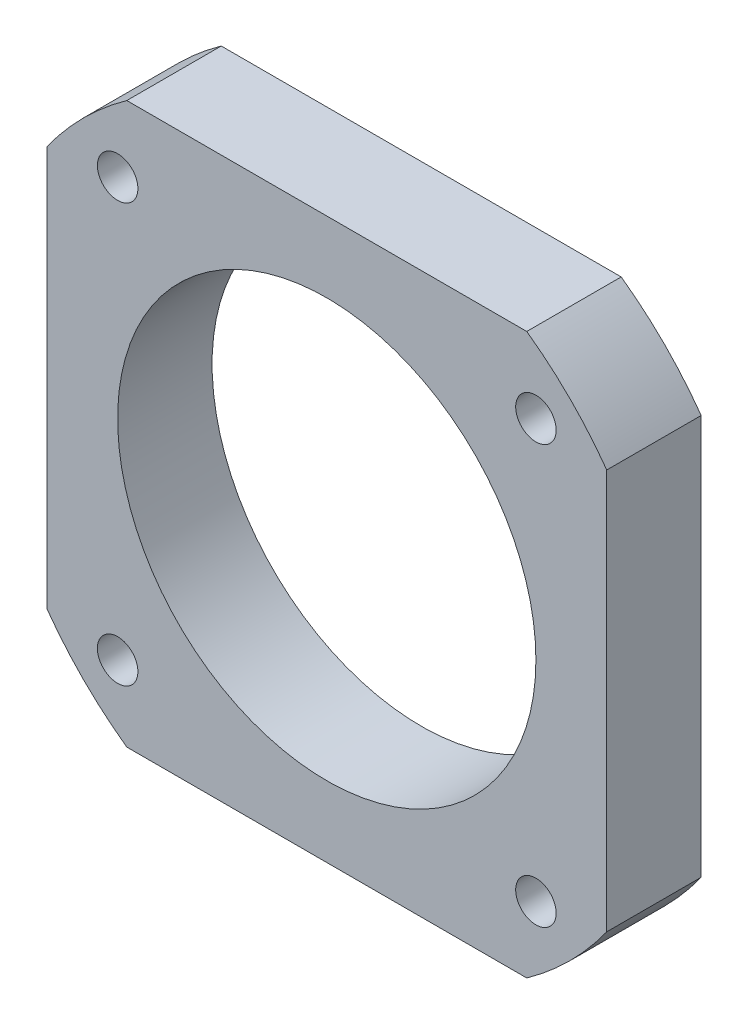
ISO-10303-21;
HEADER;
FILE_DESCRIPTION(('STEP AP214'),'2;1');
FILE_NAME('part.step','',(''),(''),'','','');
FILE_SCHEMA(('AUTOMOTIVE_DESIGN { 1 0 10303 214 1 1 1 1 }'));
ENDSEC;
DATA;
#1=APPLICATION_CONTEXT('core data for automotive mechanical design processes');
#2=APPLICATION_PROTOCOL_DEFINITION('international standard','automotive_design',2000,#1);
#3=PRODUCT_CONTEXT('',#1,'mechanical');
#4=PRODUCT('Part','Part','',(#3));
#5=PRODUCT_RELATED_PRODUCT_CATEGORY('part','',(#4));
#6=PRODUCT_DEFINITION_FORMATION('','',#4);
#7=PRODUCT_DEFINITION_CONTEXT('part definition',#1,'design');
#8=PRODUCT_DEFINITION('design','',#6,#7);
#9=PRODUCT_DEFINITION_SHAPE('','',#8);
#10=(LENGTH_UNIT() NAMED_UNIT(*) SI_UNIT(.MILLI.,.METRE.));
#11=(NAMED_UNIT(*) PLANE_ANGLE_UNIT() SI_UNIT($,.RADIAN.));
#12=(NAMED_UNIT(*) SI_UNIT($,.STERADIAN.) SOLID_ANGLE_UNIT());
#13=UNCERTAINTY_MEASURE_WITH_UNIT(LENGTH_MEASURE(1.E-05),#10,'distance_accuracy_value','');
#14=(GEOMETRIC_REPRESENTATION_CONTEXT(3) GLOBAL_UNCERTAINTY_ASSIGNED_CONTEXT((#13)) GLOBAL_UNIT_ASSIGNED_CONTEXT((#10,
#11,#12)) REPRESENTATION_CONTEXT('',''));
#15=CARTESIAN_POINT('',(0.,0.,0.));
#16=DIRECTION('',(0.,0.,1.));
#17=DIRECTION('',(1.,0.,0.));
#18=AXIS2_PLACEMENT_3D('',#15,#16,#17);
#19=CARTESIAN_POINT('',(0.,0.,0.));
#20=DIRECTION('',(0.,0.,-1.));
#21=DIRECTION('',(0.,-1.,0.));
#22=AXIS2_PLACEMENT_3D('',#19,#20,#21);
#23=PLANE('',#22);
#24=DIRECTION('',(-1.,0.,0.));
#25=VECTOR('',#24,1.);
#26=CARTESIAN_POINT('',(-14.8218588577816,-20.75,0.));
#27=LINE('',#26,#25);
#28=CARTESIAN_POINT('',(14.8218588577816,-20.75,0.));
#29=VERTEX_POINT('',#28);
#30=CARTESIAN_POINT('',(-14.8218588577816,-20.75,0.));
#31=VERTEX_POINT('',#30);
#32=EDGE_CURVE('E128',#29,#31,#27,.T.);
#33=ORIENTED_EDGE('',*,*,#32,.T.);
#34=CARTESIAN_POINT('',(0.,0.,0.));
#35=DIRECTION('',(0.,0.,-1.));
#36=DIRECTION('',(1.,0.,0.));
#37=AXIS2_PLACEMENT_3D('',#34,#35,#36);
#38=CIRCLE('',#37,25.5);
#39=CARTESIAN_POINT('',(-20.75,-14.8218588577816,0.));
#40=VERTEX_POINT('',#39);
#41=EDGE_CURVE('E112',#31,#40,#38,.T.);
#42=ORIENTED_EDGE('',*,*,#41,.T.);
#43=DIRECTION('',(0.,1.,0.));
#44=VECTOR('',#43,1.);
#45=CARTESIAN_POINT('',(-20.75,14.8218588577816,0.));
#46=LINE('',#45,#44);
#47=CARTESIAN_POINT('',(-20.75,14.8218588577816,0.));
#48=VERTEX_POINT('',#47);
#49=EDGE_CURVE('E160',#40,#48,#46,.T.);
#50=ORIENTED_EDGE('',*,*,#49,.T.);
#51=CARTESIAN_POINT('',(0.,0.,0.));
#52=DIRECTION('',(0.,0.,-1.));
#53=DIRECTION('',(1.,0.,0.));
#54=AXIS2_PLACEMENT_3D('',#51,#52,#53);
#55=CIRCLE('',#54,25.5);
#56=CARTESIAN_POINT('',(-14.8218588577816,20.75,0.));
#57=VERTEX_POINT('',#56);
#58=EDGE_CURVE('E152',#48,#57,#55,.T.);
#59=ORIENTED_EDGE('',*,*,#58,.T.);
#60=DIRECTION('',(1.,0.,0.));
#61=VECTOR('',#60,1.);
#62=CARTESIAN_POINT('',(14.8218588577816,20.75,0.));
#63=LINE('',#62,#61);
#64=CARTESIAN_POINT('',(14.8218588577816,20.75,0.));
#65=VERTEX_POINT('',#64);
#66=EDGE_CURVE('E168',#57,#65,#63,.T.);
#67=ORIENTED_EDGE('',*,*,#66,.T.);
#68=CARTESIAN_POINT('',(0.,0.,0.));
#69=DIRECTION('',(0.,0.,-1.));
#70=DIRECTION('',(1.,0.,0.));
#71=AXIS2_PLACEMENT_3D('',#68,#69,#70);
#72=CIRCLE('',#71,25.5);
#73=CARTESIAN_POINT('',(20.75,14.8218588577816,0.));
#74=VERTEX_POINT('',#73);
#75=EDGE_CURVE('E94',#65,#74,#72,.T.);
#76=ORIENTED_EDGE('',*,*,#75,.T.);
#77=DIRECTION('',(0.,-1.,0.));
#78=VECTOR('',#77,1.);
#79=CARTESIAN_POINT('',(20.75,-14.8218588577816,0.));
#80=LINE('',#79,#78);
#81=CARTESIAN_POINT('',(20.75,-14.8218588577816,0.));
#82=VERTEX_POINT('',#81);
#83=EDGE_CURVE('E175',#74,#82,#80,.T.);
#84=ORIENTED_EDGE('',*,*,#83,.T.);
#85=CARTESIAN_POINT('',(0.,0.,0.));
#86=DIRECTION('',(0.,0.,-1.));
#87=DIRECTION('',(1.,0.,0.));
#88=AXIS2_PLACEMENT_3D('',#85,#86,#87);
#89=CIRCLE('',#88,25.5);
#90=EDGE_CURVE('E26',#82,#29,#89,.T.);
#91=ORIENTED_EDGE('',*,*,#90,.T.);
#92=EDGE_LOOP('',(#33,#42,#50,#59,#67,#76,#84,#91));
#93=FACE_BOUND('',#92,.T.);
#94=CARTESIAN_POINT('',(0.,0.,0.));
#95=DIRECTION('',(0.,0.,-1.));
#96=DIRECTION('',(1.,0.,0.));
#97=AXIS2_PLACEMENT_3D('',#94,#95,#96);
#98=CIRCLE('',#97,15.5);
#99=CARTESIAN_POINT('',(15.5,0.,0.));
#100=VERTEX_POINT('',#99);
#101=EDGE_CURVE('E147',#100,#100,#98,.T.);
#102=ORIENTED_EDGE('',*,*,#101,.F.);
#103=EDGE_LOOP('',(#102));
#104=FACE_BOUND('',#103,.T.);
#105=CARTESIAN_POINT('',(15.5,15.5,0.));
#106=DIRECTION('',(0.,0.,1.));
#107=DIRECTION('',(1.,0.,0.));
#108=AXIS2_PLACEMENT_3D('',#105,#106,#107);
#109=CIRCLE('',#108,1.5);
#110=CARTESIAN_POINT('',(17.,15.5,0.));
#111=VERTEX_POINT('',#110);
#112=EDGE_CURVE('E214',#111,#111,#109,.T.);
#113=ORIENTED_EDGE('',*,*,#112,.T.);
#114=EDGE_LOOP('',(#113));
#115=FACE_BOUND('',#114,.T.);
#116=CARTESIAN_POINT('',(-15.5,-15.5,0.));
#117=DIRECTION('',(0.,0.,1.));
#118=DIRECTION('',(1.,0.,0.));
#119=AXIS2_PLACEMENT_3D('',#116,#117,#118);
#120=CIRCLE('',#119,1.5);
#121=CARTESIAN_POINT('',(-14.,-15.5,0.));
#122=VERTEX_POINT('',#121);
#123=EDGE_CURVE('E222',#122,#122,#120,.T.);
#124=ORIENTED_EDGE('',*,*,#123,.T.);
#125=EDGE_LOOP('',(#124));
#126=FACE_BOUND('',#125,.T.);
#127=CARTESIAN_POINT('',(-15.5,15.5,0.));
#128=DIRECTION('',(0.,0.,1.));
#129=DIRECTION('',(1.,0.,0.));
#130=AXIS2_PLACEMENT_3D('',#127,#128,#129);
#131=CIRCLE('',#130,1.5);
#132=CARTESIAN_POINT('',(-14.,15.5,0.));
#133=VERTEX_POINT('',#132);
#134=EDGE_CURVE('E234',#133,#133,#131,.T.);
#135=ORIENTED_EDGE('',*,*,#134,.T.);
#136=EDGE_LOOP('',(#135));
#137=FACE_BOUND('',#136,.T.);
#138=CARTESIAN_POINT('',(15.5,-15.5,0.));
#139=DIRECTION('',(0.,0.,1.));
#140=DIRECTION('',(1.,0.,0.));
#141=AXIS2_PLACEMENT_3D('',#138,#139,#140);
#142=CIRCLE('',#141,1.5);
#143=CARTESIAN_POINT('',(17.,-15.5,0.));
#144=VERTEX_POINT('',#143);
#145=EDGE_CURVE('E198',#144,#144,#142,.T.);
#146=ORIENTED_EDGE('',*,*,#145,.T.);
#147=EDGE_LOOP('',(#146));
#148=FACE_BOUND('',#147,.T.);
#149=ADVANCED_FACE('F17',(#93,#104,#115,#126,#137,#148),#23,.T.);
#150=CARTESIAN_POINT('',(0.,0.,7.));
#151=DIRECTION('',(0.,0.,-1.));
#152=DIRECTION('',(0.,-1.,0.));
#153=AXIS2_PLACEMENT_3D('',#150,#151,#152);
#154=PLANE('',#153);
#155=DIRECTION('',(-1.,0.,0.));
#156=VECTOR('',#155,1.);
#157=CARTESIAN_POINT('',(-14.8218588577816,-20.75,7.));
#158=LINE('',#157,#156);
#159=CARTESIAN_POINT('',(14.8218588577816,-20.75,7.));
#160=VERTEX_POINT('',#159);
#161=CARTESIAN_POINT('',(-14.8218588577816,-20.75,7.));
#162=VERTEX_POINT('',#161);
#163=EDGE_CURVE('E129',#160,#162,#158,.T.);
#164=ORIENTED_EDGE('',*,*,#163,.F.);
#165=CARTESIAN_POINT('',(0.,0.,7.));
#166=DIRECTION('',(0.,0.,-1.));
#167=DIRECTION('',(1.,0.,0.));
#168=AXIS2_PLACEMENT_3D('',#165,#166,#167);
#169=CIRCLE('',#168,25.5);
#170=CARTESIAN_POINT('',(20.75,-14.8218588577816,7.));
#171=VERTEX_POINT('',#170);
#172=EDGE_CURVE('E11',#171,#160,#169,.T.);
#173=ORIENTED_EDGE('',*,*,#172,.F.);
#174=DIRECTION('',(0.,-1.,0.));
#175=VECTOR('',#174,1.);
#176=CARTESIAN_POINT('',(20.75,-14.8218588577816,7.));
#177=LINE('',#176,#175);
#178=CARTESIAN_POINT('',(20.75,14.8218588577816,7.));
#179=VERTEX_POINT('',#178);
#180=EDGE_CURVE('E178',#179,#171,#177,.T.);
#181=ORIENTED_EDGE('',*,*,#180,.F.);
#182=CARTESIAN_POINT('',(0.,0.,7.));
#183=DIRECTION('',(0.,0.,-1.));
#184=DIRECTION('',(1.,0.,0.));
#185=AXIS2_PLACEMENT_3D('',#182,#183,#184);
#186=CIRCLE('',#185,25.5);
#187=CARTESIAN_POINT('',(14.8218588577816,20.75,7.));
#188=VERTEX_POINT('',#187);
#189=EDGE_CURVE('E86',#188,#179,#186,.T.);
#190=ORIENTED_EDGE('',*,*,#189,.F.);
#191=DIRECTION('',(1.,0.,0.));
#192=VECTOR('',#191,1.);
#193=CARTESIAN_POINT('',(14.8218588577816,20.75,7.));
#194=LINE('',#193,#192);
#195=CARTESIAN_POINT('',(-14.8218588577816,20.75,7.));
#196=VERTEX_POINT('',#195);
#197=EDGE_CURVE('E163',#196,#188,#194,.T.);
#198=ORIENTED_EDGE('',*,*,#197,.F.);
#199=CARTESIAN_POINT('',(0.,0.,7.));
#200=DIRECTION('',(0.,0.,-1.));
#201=DIRECTION('',(1.,0.,0.));
#202=AXIS2_PLACEMENT_3D('',#199,#200,#201);
#203=CIRCLE('',#202,25.5);
#204=CARTESIAN_POINT('',(-20.75,14.8218588577816,7.));
#205=VERTEX_POINT('',#204);
#206=EDGE_CURVE('E174',#205,#196,#203,.T.);
#207=ORIENTED_EDGE('',*,*,#206,.F.);
#208=DIRECTION('',(0.,1.,0.));
#209=VECTOR('',#208,1.);
#210=CARTESIAN_POINT('',(-20.75,14.8218588577816,7.));
#211=LINE('',#210,#209);
#212=CARTESIAN_POINT('',(-20.75,-14.8218588577816,7.));
#213=VERTEX_POINT('',#212);
#214=EDGE_CURVE('E153',#213,#205,#211,.T.);
#215=ORIENTED_EDGE('',*,*,#214,.F.);
#216=CARTESIAN_POINT('',(0.,0.,7.));
#217=DIRECTION('',(0.,0.,-1.));
#218=DIRECTION('',(1.,0.,0.));
#219=AXIS2_PLACEMENT_3D('',#216,#217,#218);
#220=CIRCLE('',#219,25.5);
#221=EDGE_CURVE('E122',#162,#213,#220,.T.);
#222=ORIENTED_EDGE('',*,*,#221,.F.);
#223=EDGE_LOOP('',(#164,#173,#181,#190,#198,#207,#215,#222));
#224=FACE_BOUND('',#223,.T.);
#225=CARTESIAN_POINT('',(0.,0.,7.));
#226=DIRECTION('',(0.,0.,-1.));
#227=DIRECTION('',(1.,0.,0.));
#228=AXIS2_PLACEMENT_3D('',#225,#226,#227);
#229=CIRCLE('',#228,15.5);
#230=CARTESIAN_POINT('',(15.5,0.,7.));
#231=VERTEX_POINT('',#230);
#232=EDGE_CURVE('E143',#231,#231,#229,.T.);
#233=ORIENTED_EDGE('',*,*,#232,.T.);
#234=EDGE_LOOP('',(#233));
#235=FACE_BOUND('',#234,.T.);
#236=CARTESIAN_POINT('',(15.5,15.5,7.));
#237=DIRECTION('',(0.,0.,1.));
#238=DIRECTION('',(1.,0.,0.));
#239=AXIS2_PLACEMENT_3D('',#236,#237,#238);
#240=CIRCLE('',#239,1.5);
#241=CARTESIAN_POINT('',(17.,15.5,7.));
#242=VERTEX_POINT('',#241);
#243=EDGE_CURVE('E210',#242,#242,#240,.T.);
#244=ORIENTED_EDGE('',*,*,#243,.F.);
#245=EDGE_LOOP('',(#244));
#246=FACE_BOUND('',#245,.T.);
#247=CARTESIAN_POINT('',(-15.5,-15.5,7.));
#248=DIRECTION('',(0.,0.,1.));
#249=DIRECTION('',(1.,0.,0.));
#250=AXIS2_PLACEMENT_3D('',#247,#248,#249);
#251=CIRCLE('',#250,1.5);
#252=CARTESIAN_POINT('',(-14.,-15.5,7.));
#253=VERTEX_POINT('',#252);
#254=EDGE_CURVE('E218',#253,#253,#251,.T.);
#255=ORIENTED_EDGE('',*,*,#254,.F.);
#256=EDGE_LOOP('',(#255));
#257=FACE_BOUND('',#256,.T.);
#258=CARTESIAN_POINT('',(-15.5,15.5,7.));
#259=DIRECTION('',(0.,0.,1.));
#260=DIRECTION('',(1.,0.,0.));
#261=AXIS2_PLACEMENT_3D('',#258,#259,#260);
#262=CIRCLE('',#261,1.5);
#263=CARTESIAN_POINT('',(-14.,15.5,7.));
#264=VERTEX_POINT('',#263);
#265=EDGE_CURVE('E230',#264,#264,#262,.T.);
#266=ORIENTED_EDGE('',*,*,#265,.F.);
#267=EDGE_LOOP('',(#266));
#268=FACE_BOUND('',#267,.T.);
#269=CARTESIAN_POINT('',(15.5,-15.5,7.));
#270=DIRECTION('',(0.,0.,1.));
#271=DIRECTION('',(1.,0.,0.));
#272=AXIS2_PLACEMENT_3D('',#269,#270,#271);
#273=CIRCLE('',#272,1.5);
#274=CARTESIAN_POINT('',(17.,-15.5,7.));
#275=VERTEX_POINT('',#274);
#276=EDGE_CURVE('E226',#275,#275,#273,.T.);
#277=ORIENTED_EDGE('',*,*,#276,.F.);
#278=EDGE_LOOP('',(#277));
#279=FACE_BOUND('',#278,.T.);
#280=ADVANCED_FACE('F245',(#224,#235,#246,#257,#268,#279),#154,.F.);
#281=CARTESIAN_POINT('',(0.,0.,7.));
#282=DIRECTION('',(0.,0.,-1.));
#283=DIRECTION('',(-1.,0.,0.));
#284=AXIS2_PLACEMENT_3D('',#281,#282,#283);
#285=CYLINDRICAL_SURFACE('',#284,25.5);
#286=ORIENTED_EDGE('',*,*,#90,.F.);
#287=DIRECTION('',(0.,0.,-1.));
#288=VECTOR('',#287,1.);
#289=CARTESIAN_POINT('',(20.75,-14.8218588577816,7.));
#290=LINE('',#289,#288);
#291=EDGE_CURVE('E148',#171,#82,#290,.T.);
#292=ORIENTED_EDGE('',*,*,#291,.F.);
#293=ORIENTED_EDGE('',*,*,#172,.T.);
#294=DIRECTION('',(0.,0.,-1.));
#295=VECTOR('',#294,1.);
#296=CARTESIAN_POINT('',(14.8218588577816,-20.75,7.));
#297=LINE('',#296,#295);
#298=EDGE_CURVE('E134',#160,#29,#297,.T.);
#299=ORIENTED_EDGE('',*,*,#298,.T.);
#300=EDGE_LOOP('',(#286,#292,#293,#299));
#301=FACE_BOUND('',#300,.T.);
#302=ADVANCED_FACE('F247',(#301),#285,.T.);
#303=CARTESIAN_POINT('',(15.5,-15.5,7.));
#304=DIRECTION('',(0.,0.,-1.));
#305=DIRECTION('',(-1.,0.,0.));
#306=AXIS2_PLACEMENT_3D('',#303,#304,#305);
#307=CYLINDRICAL_SURFACE('',#306,1.5);
#308=ORIENTED_EDGE('',*,*,#145,.F.);
#309=EDGE_LOOP('',(#308));
#310=FACE_BOUND('',#309,.T.);
#311=ORIENTED_EDGE('',*,*,#276,.T.);
#312=EDGE_LOOP('',(#311));
#313=FACE_BOUND('',#312,.T.);
#314=ADVANCED_FACE('F243',(#310,#313),#307,.F.);
#315=CARTESIAN_POINT('',(-15.5,15.5,7.));
#316=DIRECTION('',(0.,0.,-1.));
#317=DIRECTION('',(-1.,0.,0.));
#318=AXIS2_PLACEMENT_3D('',#315,#316,#317);
#319=CYLINDRICAL_SURFACE('',#318,1.5);
#320=ORIENTED_EDGE('',*,*,#134,.F.);
#321=EDGE_LOOP('',(#320));
#322=FACE_BOUND('',#321,.T.);
#323=ORIENTED_EDGE('',*,*,#265,.T.);
#324=EDGE_LOOP('',(#323));
#325=FACE_BOUND('',#324,.T.);
#326=ADVANCED_FACE('F291',(#322,#325),#319,.F.);
#327=CARTESIAN_POINT('',(-15.5,-15.5,7.));
#328=DIRECTION('',(0.,0.,-1.));
#329=DIRECTION('',(-1.,0.,0.));
#330=AXIS2_PLACEMENT_3D('',#327,#328,#329);
#331=CYLINDRICAL_SURFACE('',#330,1.5);
#332=ORIENTED_EDGE('',*,*,#123,.F.);
#333=EDGE_LOOP('',(#332));
#334=FACE_BOUND('',#333,.T.);
#335=ORIENTED_EDGE('',*,*,#254,.T.);
#336=EDGE_LOOP('',(#335));
#337=FACE_BOUND('',#336,.T.);
#338=ADVANCED_FACE('F287',(#334,#337),#331,.F.);
#339=CARTESIAN_POINT('',(15.5,15.5,7.));
#340=DIRECTION('',(0.,0.,-1.));
#341=DIRECTION('',(-1.,0.,0.));
#342=AXIS2_PLACEMENT_3D('',#339,#340,#341);
#343=CYLINDRICAL_SURFACE('',#342,1.5);
#344=ORIENTED_EDGE('',*,*,#112,.F.);
#345=EDGE_LOOP('',(#344));
#346=FACE_BOUND('',#345,.T.);
#347=ORIENTED_EDGE('',*,*,#243,.T.);
#348=EDGE_LOOP('',(#347));
#349=FACE_BOUND('',#348,.T.);
#350=ADVANCED_FACE('F283',(#346,#349),#343,.F.);
#351=CARTESIAN_POINT('',(0.,0.,7.));
#352=DIRECTION('',(0.,0.,-1.));
#353=DIRECTION('',(-1.,0.,0.));
#354=AXIS2_PLACEMENT_3D('',#351,#352,#353);
#355=CYLINDRICAL_SURFACE('',#354,15.5);
#356=ORIENTED_EDGE('',*,*,#101,.T.);
#357=EDGE_LOOP('',(#356));
#358=FACE_BOUND('',#357,.T.);
#359=ORIENTED_EDGE('',*,*,#232,.F.);
#360=EDGE_LOOP('',(#359));
#361=FACE_BOUND('',#360,.T.);
#362=ADVANCED_FACE('F277',(#358,#361),#355,.F.);
#363=CARTESIAN_POINT('',(20.75,-14.8218588577816,7.));
#364=DIRECTION('',(1.,0.,0.));
#365=DIRECTION('',(0.,-1.,0.));
#366=AXIS2_PLACEMENT_3D('',#363,#364,#365);
#367=PLANE('',#366);
#368=ORIENTED_EDGE('',*,*,#83,.F.);
#369=DIRECTION('',(0.,0.,-1.));
#370=VECTOR('',#369,1.);
#371=CARTESIAN_POINT('',(20.75,14.8218588577816,7.));
#372=LINE('',#371,#370);
#373=EDGE_CURVE('E179',#179,#74,#372,.T.);
#374=ORIENTED_EDGE('',*,*,#373,.F.);
#375=ORIENTED_EDGE('',*,*,#180,.T.);
#376=ORIENTED_EDGE('',*,*,#291,.T.);
#377=EDGE_LOOP('',(#368,#374,#375,#376));
#378=FACE_BOUND('',#377,.T.);
#379=ADVANCED_FACE('F274',(#378),#367,.T.);
#380=CARTESIAN_POINT('',(0.,0.,7.));
#381=DIRECTION('',(0.,0.,-1.));
#382=DIRECTION('',(-1.,0.,0.));
#383=AXIS2_PLACEMENT_3D('',#380,#381,#382);
#384=CYLINDRICAL_SURFACE('',#383,25.5);
#385=ORIENTED_EDGE('',*,*,#75,.F.);
#386=DIRECTION('',(0.,0.,-1.));
#387=VECTOR('',#386,1.);
#388=CARTESIAN_POINT('',(14.8218588577816,20.75,7.));
#389=LINE('',#388,#387);
#390=EDGE_CURVE('E167',#188,#65,#389,.T.);
#391=ORIENTED_EDGE('',*,*,#390,.F.);
#392=ORIENTED_EDGE('',*,*,#189,.T.);
#393=ORIENTED_EDGE('',*,*,#373,.T.);
#394=EDGE_LOOP('',(#385,#391,#392,#393));
#395=FACE_BOUND('',#394,.T.);
#396=ADVANCED_FACE('F272',(#395),#384,.T.);
#397=CARTESIAN_POINT('',(14.8218588577816,20.75,7.));
#398=DIRECTION('',(0.,1.,0.));
#399=DIRECTION('',(1.,0.,0.));
#400=AXIS2_PLACEMENT_3D('',#397,#398,#399);
#401=PLANE('',#400);
#402=ORIENTED_EDGE('',*,*,#66,.F.);
#403=DIRECTION('',(0.,0.,-1.));
#404=VECTOR('',#403,1.);
#405=CARTESIAN_POINT('',(-14.8218588577816,20.75,7.));
#406=LINE('',#405,#404);
#407=EDGE_CURVE('E183',#196,#57,#406,.T.);
#408=ORIENTED_EDGE('',*,*,#407,.F.);
#409=ORIENTED_EDGE('',*,*,#197,.T.);
#410=ORIENTED_EDGE('',*,*,#390,.T.);
#411=EDGE_LOOP('',(#402,#408,#409,#410));
#412=FACE_BOUND('',#411,.T.);
#413=ADVANCED_FACE('F265',(#412),#401,.T.);
#414=CARTESIAN_POINT('',(0.,0.,7.));
#415=DIRECTION('',(0.,0.,-1.));
#416=DIRECTION('',(-1.,0.,0.));
#417=AXIS2_PLACEMENT_3D('',#414,#415,#416);
#418=CYLINDRICAL_SURFACE('',#417,25.5);
#419=ORIENTED_EDGE('',*,*,#58,.F.);
#420=DIRECTION('',(0.,0.,-1.));
#421=VECTOR('',#420,1.);
#422=CARTESIAN_POINT('',(-20.75,14.8218588577816,7.));
#423=LINE('',#422,#421);
#424=EDGE_CURVE('E149',#205,#48,#423,.T.);
#425=ORIENTED_EDGE('',*,*,#424,.F.);
#426=ORIENTED_EDGE('',*,*,#206,.T.);
#427=ORIENTED_EDGE('',*,*,#407,.T.);
#428=EDGE_LOOP('',(#419,#425,#426,#427));
#429=FACE_BOUND('',#428,.T.);
#430=ADVANCED_FACE('F262',(#429),#418,.T.);
#431=CARTESIAN_POINT('',(-20.75,14.8218588577816,7.));
#432=DIRECTION('',(-1.,0.,0.));
#433=DIRECTION('',(0.,1.,0.));
#434=AXIS2_PLACEMENT_3D('',#431,#432,#433);
#435=PLANE('',#434);
#436=ORIENTED_EDGE('',*,*,#49,.F.);
#437=DIRECTION('',(0.,0.,-1.));
#438=VECTOR('',#437,1.);
#439=CARTESIAN_POINT('',(-20.75,-14.8218588577816,7.));
#440=LINE('',#439,#438);
#441=EDGE_CURVE('E119',#213,#40,#440,.T.);
#442=ORIENTED_EDGE('',*,*,#441,.F.);
#443=ORIENTED_EDGE('',*,*,#214,.T.);
#444=ORIENTED_EDGE('',*,*,#424,.T.);
#445=EDGE_LOOP('',(#436,#442,#443,#444));
#446=FACE_BOUND('',#445,.T.);
#447=ADVANCED_FACE('F261',(#446),#435,.T.);
#448=CARTESIAN_POINT('',(0.,0.,7.));
#449=DIRECTION('',(0.,0.,-1.));
#450=DIRECTION('',(-1.,0.,0.));
#451=AXIS2_PLACEMENT_3D('',#448,#449,#450);
#452=CYLINDRICAL_SURFACE('',#451,25.5);
#453=ORIENTED_EDGE('',*,*,#41,.F.);
#454=DIRECTION('',(0.,0.,-1.));
#455=VECTOR('',#454,1.);
#456=CARTESIAN_POINT('',(-14.8218588577816,-20.75,7.));
#457=LINE('',#456,#455);
#458=EDGE_CURVE('E116',#162,#31,#457,.T.);
#459=ORIENTED_EDGE('',*,*,#458,.F.);
#460=ORIENTED_EDGE('',*,*,#221,.T.);
#461=ORIENTED_EDGE('',*,*,#441,.T.);
#462=EDGE_LOOP('',(#453,#459,#460,#461));
#463=FACE_BOUND('',#462,.T.);
#464=ADVANCED_FACE('F114',(#463),#452,.T.);
#465=CARTESIAN_POINT('',(-14.8218588577816,-20.75,7.));
#466=DIRECTION('',(0.,-1.,0.));
#467=DIRECTION('',(0.,0.,-1.));
#468=AXIS2_PLACEMENT_3D('',#465,#466,#467);
#469=PLANE('',#468);
#470=ORIENTED_EDGE('',*,*,#32,.F.);
#471=ORIENTED_EDGE('',*,*,#298,.F.);
#472=ORIENTED_EDGE('',*,*,#163,.T.);
#473=ORIENTED_EDGE('',*,*,#458,.T.);
#474=EDGE_LOOP('',(#470,#471,#472,#473));
#475=FACE_BOUND('',#474,.T.);
#476=ADVANCED_FACE('F126',(#475),#469,.T.);
#477=CLOSED_SHELL('',(#149,#280,#302,#314,#326,#338,#350,#362,#379,#396,#413,#430,#447,#464,#476));
#478=MANIFOLD_SOLID_BREP('B1',#477);
#479=ADVANCED_BREP_SHAPE_REPRESENTATION('',(#18,#478),#14);
#480=SHAPE_DEFINITION_REPRESENTATION(#9,#479);
ENDSEC;
END-ISO-10303-21;
